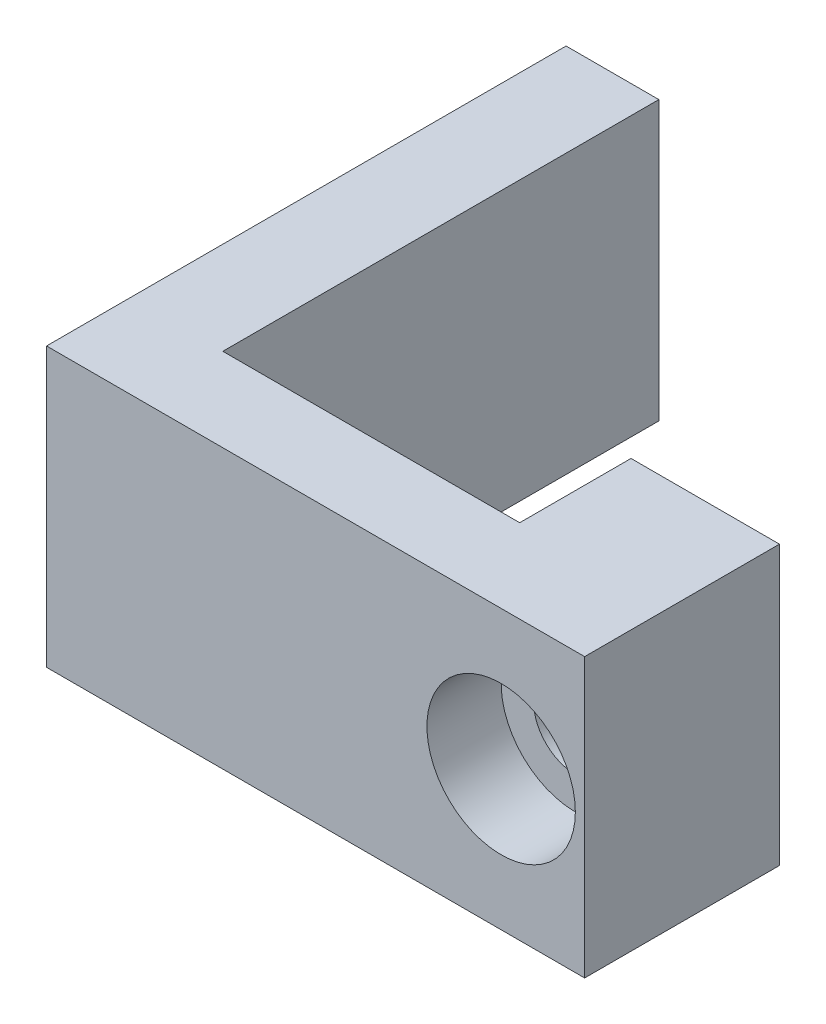
ISO-10303-21;
HEADER;
FILE_DESCRIPTION(('STEP AP214'),'2;1');
FILE_NAME('part.step','',(''),(''),'','','');
FILE_SCHEMA(('AUTOMOTIVE_DESIGN { 1 0 10303 214 1 1 1 1 }'));
ENDSEC;
DATA;
#1=APPLICATION_CONTEXT('core data for automotive mechanical design processes');
#2=APPLICATION_PROTOCOL_DEFINITION('international standard','automotive_design',2000,#1);
#3=PRODUCT_CONTEXT('',#1,'mechanical');
#4=PRODUCT('Part','Part','',(#3));
#5=PRODUCT_RELATED_PRODUCT_CATEGORY('part','',(#4));
#6=PRODUCT_DEFINITION_FORMATION('','',#4);
#7=PRODUCT_DEFINITION_CONTEXT('part definition',#1,'design');
#8=PRODUCT_DEFINITION('design','',#6,#7);
#9=PRODUCT_DEFINITION_SHAPE('','',#8);
#10=(LENGTH_UNIT() NAMED_UNIT(*) SI_UNIT(.MILLI.,.METRE.));
#11=(NAMED_UNIT(*) PLANE_ANGLE_UNIT() SI_UNIT($,.RADIAN.));
#12=(NAMED_UNIT(*) SI_UNIT($,.STERADIAN.) SOLID_ANGLE_UNIT());
#13=UNCERTAINTY_MEASURE_WITH_UNIT(LENGTH_MEASURE(1.E-05),#10,'distance_accuracy_value','');
#14=(GEOMETRIC_REPRESENTATION_CONTEXT(3) GLOBAL_UNCERTAINTY_ASSIGNED_CONTEXT((#13)) GLOBAL_UNIT_ASSIGNED_CONTEXT((#10,
#11,#12)) REPRESENTATION_CONTEXT('',''));
#15=CARTESIAN_POINT('',(0.,0.,0.));
#16=DIRECTION('',(0.,0.,1.));
#17=DIRECTION('',(1.,0.,0.));
#18=AXIS2_PLACEMENT_3D('',#15,#16,#17);
#19=CARTESIAN_POINT('',(-62.,47.8112887414928,17.5));
#20=DIRECTION('',(-1.,0.,0.));
#21=DIRECTION('',(0.,0.,-1.));
#22=AXIS2_PLACEMENT_3D('',#19,#20,#21);
#23=PLANE('',#22);
#24=DIRECTION('',(0.,0.,1.));
#25=VECTOR('',#24,1.);
#26=CARTESIAN_POINT('',(-62.,7.5,17.5));
#27=LINE('',#26,#25);
#28=CARTESIAN_POINT('',(-62.,7.5,17.5));
#29=VERTEX_POINT('',#28);
#30=CARTESIAN_POINT('',(-62.,7.50000000000001,28.));
#31=VERTEX_POINT('',#30);
#32=EDGE_CURVE('E110',#29,#31,#27,.T.);
#33=ORIENTED_EDGE('',*,*,#32,.T.);
#34=DIRECTION('',(0.,-1.,0.));
#35=VECTOR('',#34,1.);
#36=CARTESIAN_POINT('',(-62.,47.8112887414928,28.));
#37=LINE('',#36,#35);
#38=CARTESIAN_POINT('',(-62.,-7.5,28.));
#39=VERTEX_POINT('',#38);
#40=EDGE_CURVE('E115',#31,#39,#37,.T.);
#41=ORIENTED_EDGE('',*,*,#40,.T.);
#42=DIRECTION('',(0.,0.,-1.));
#43=VECTOR('',#42,1.);
#44=CARTESIAN_POINT('',(-62.,-7.5,17.5));
#45=LINE('',#44,#43);
#46=CARTESIAN_POINT('',(-62.,-7.5,17.5));
#47=VERTEX_POINT('',#46);
#48=EDGE_CURVE('E133',#39,#47,#45,.T.);
#49=ORIENTED_EDGE('',*,*,#48,.T.);
#50=DIRECTION('',(0.,-1.,0.));
#51=VECTOR('',#50,1.);
#52=CARTESIAN_POINT('',(-62.,47.8112887414928,17.5));
#53=LINE('',#52,#51);
#54=EDGE_CURVE('E119',#29,#47,#53,.T.);
#55=ORIENTED_EDGE('',*,*,#54,.F.);
#56=EDGE_LOOP('',(#33,#41,#49,#55));
#57=FACE_BOUND('',#56,.T.);
#58=ADVANCED_FACE('F32',(#57),#23,.F.);
#59=CARTESIAN_POINT('',(-62.,47.8112887414928,28.));
#60=DIRECTION('',(0.,0.,-1.));
#61=DIRECTION('',(1.,0.,0.));
#62=AXIS2_PLACEMENT_3D('',#59,#60,#61);
#63=PLANE('',#62);
#64=CARTESIAN_POINT('',(-66.5,0.,28.));
#65=DIRECTION('',(0.,0.,1.));
#66=DIRECTION('',(1.,0.,0.));
#67=AXIS2_PLACEMENT_3D('',#64,#65,#66);
#68=CIRCLE('',#67,3.99999999999999);
#69=CARTESIAN_POINT('',(-62.5,0.,28.));
#70=VERTEX_POINT('',#69);
#71=EDGE_CURVE('E245',#70,#70,#68,.T.);
#72=ORIENTED_EDGE('',*,*,#71,.F.);
#73=EDGE_LOOP('',(#72));
#74=FACE_BOUND('',#73,.T.);
#75=DIRECTION('',(-1.,0.,0.));
#76=VECTOR('',#75,1.);
#77=CARTESIAN_POINT('',(-62.,7.5,28.));
#78=LINE('',#77,#76);
#79=CARTESIAN_POINT('',(-91.,7.50000000000001,28.));
#80=VERTEX_POINT('',#79);
#81=EDGE_CURVE('E107',#31,#80,#78,.T.);
#82=ORIENTED_EDGE('',*,*,#81,.T.);
#83=DIRECTION('',(0.,-1.,0.));
#84=VECTOR('',#83,1.);
#85=CARTESIAN_POINT('',(-91.,47.8112887414928,28.));
#86=LINE('',#85,#84);
#87=CARTESIAN_POINT('',(-91.,-7.50000000000001,28.));
#88=VERTEX_POINT('',#87);
#89=EDGE_CURVE('E118',#80,#88,#86,.T.);
#90=ORIENTED_EDGE('',*,*,#89,.T.);
#91=DIRECTION('',(1.,0.,0.));
#92=VECTOR('',#91,1.);
#93=CARTESIAN_POINT('',(-62.,-7.5,28.));
#94=LINE('',#93,#92);
#95=EDGE_CURVE('E128',#88,#39,#94,.T.);
#96=ORIENTED_EDGE('',*,*,#95,.T.);
#97=ORIENTED_EDGE('',*,*,#40,.F.);
#98=EDGE_LOOP('',(#82,#90,#96,#97));
#99=FACE_BOUND('',#98,.T.);
#100=ADVANCED_FACE('F172',(#74,#99),#63,.F.);
#101=CARTESIAN_POINT('',(-91.,47.8112887414928,28.));
#102=DIRECTION('',(1.,0.,0.));
#103=DIRECTION('',(0.,0.,1.));
#104=AXIS2_PLACEMENT_3D('',#101,#102,#103);
#105=PLANE('',#104);
#106=DIRECTION('',(0.,0.,-1.));
#107=VECTOR('',#106,1.);
#108=CARTESIAN_POINT('',(-91.,7.5,28.));
#109=LINE('',#108,#107);
#110=CARTESIAN_POINT('',(-91.,7.50000000000001,0.));
#111=VERTEX_POINT('',#110);
#112=EDGE_CURVE('E101',#80,#111,#109,.T.);
#113=ORIENTED_EDGE('',*,*,#112,.T.);
#114=DIRECTION('',(0.,-1.,0.));
#115=VECTOR('',#114,1.);
#116=CARTESIAN_POINT('',(-91.,47.8112887414928,0.));
#117=LINE('',#116,#115);
#118=CARTESIAN_POINT('',(-91.,-7.5,0.));
#119=VERTEX_POINT('',#118);
#120=EDGE_CURVE('E122',#111,#119,#117,.T.);
#121=ORIENTED_EDGE('',*,*,#120,.T.);
#122=DIRECTION('',(0.,0.,1.));
#123=VECTOR('',#122,1.);
#124=CARTESIAN_POINT('',(-91.,-7.5,28.));
#125=LINE('',#124,#123);
#126=EDGE_CURVE('E164',#119,#88,#125,.T.);
#127=ORIENTED_EDGE('',*,*,#126,.T.);
#128=ORIENTED_EDGE('',*,*,#89,.F.);
#129=EDGE_LOOP('',(#113,#121,#127,#128));
#130=FACE_BOUND('',#129,.T.);
#131=ADVANCED_FACE('F165',(#130),#105,.F.);
#132=CARTESIAN_POINT('',(-91.,47.8112887414928,0.));
#133=DIRECTION('',(0.,0.,1.));
#134=DIRECTION('',(-1.,0.,0.));
#135=AXIS2_PLACEMENT_3D('',#132,#133,#134);
#136=PLANE('',#135);
#137=DIRECTION('',(1.,0.,0.));
#138=VECTOR('',#137,1.);
#139=CARTESIAN_POINT('',(-91.,7.5,0.));
#140=LINE('',#139,#138);
#141=CARTESIAN_POINT('',(-86.,7.50000000000001,0.));
#142=VERTEX_POINT('',#141);
#143=EDGE_CURVE('E99',#111,#142,#140,.T.);
#144=ORIENTED_EDGE('',*,*,#143,.T.);
#145=DIRECTION('',(0.,-1.,0.));
#146=VECTOR('',#145,1.);
#147=CARTESIAN_POINT('',(-86.,47.8112887414928,0.));
#148=LINE('',#147,#146);
#149=CARTESIAN_POINT('',(-86.,-7.5,0.));
#150=VERTEX_POINT('',#149);
#151=EDGE_CURVE('E94',#142,#150,#148,.T.);
#152=ORIENTED_EDGE('',*,*,#151,.T.);
#153=DIRECTION('',(-1.,0.,0.));
#154=VECTOR('',#153,1.);
#155=CARTESIAN_POINT('',(-91.,-7.5,0.));
#156=LINE('',#155,#154);
#157=EDGE_CURVE('E168',#150,#119,#156,.T.);
#158=ORIENTED_EDGE('',*,*,#157,.T.);
#159=ORIENTED_EDGE('',*,*,#120,.F.);
#160=EDGE_LOOP('',(#144,#152,#158,#159));
#161=FACE_BOUND('',#160,.T.);
#162=ADVANCED_FACE('F175',(#161),#136,.F.);
#163=CARTESIAN_POINT('',(-86.,47.8112887414928,23.5));
#164=DIRECTION('',(-1.,0.,0.));
#165=DIRECTION('',(0.,0.,-1.));
#166=AXIS2_PLACEMENT_3D('',#163,#164,#165);
#167=PLANE('',#166);
#168=DIRECTION('',(0.,0.,1.));
#169=VECTOR('',#168,1.);
#170=CARTESIAN_POINT('',(-86.,7.5,23.5));
#171=LINE('',#170,#169);
#172=CARTESIAN_POINT('',(-86.,7.50000000000001,23.5));
#173=VERTEX_POINT('',#172);
#174=EDGE_CURVE('E76',#142,#173,#171,.T.);
#175=ORIENTED_EDGE('',*,*,#174,.T.);
#176=DIRECTION('',(0.,-1.,0.));
#177=VECTOR('',#176,1.);
#178=CARTESIAN_POINT('',(-86.,47.8112887414928,23.5));
#179=LINE('',#178,#177);
#180=CARTESIAN_POINT('',(-86.,-7.5,23.5));
#181=VERTEX_POINT('',#180);
#182=EDGE_CURVE('E85',#173,#181,#179,.T.);
#183=ORIENTED_EDGE('',*,*,#182,.T.);
#184=DIRECTION('',(0.,0.,-1.));
#185=VECTOR('',#184,1.);
#186=CARTESIAN_POINT('',(-86.,-7.5,23.5));
#187=LINE('',#186,#185);
#188=EDGE_CURVE('E176',#181,#150,#187,.T.);
#189=ORIENTED_EDGE('',*,*,#188,.T.);
#190=ORIENTED_EDGE('',*,*,#151,.F.);
#191=EDGE_LOOP('',(#175,#183,#189,#190));
#192=FACE_BOUND('',#191,.T.);
#193=ADVANCED_FACE('F96',(#192),#167,.F.);
#194=CARTESIAN_POINT('',(-86.,47.8112887414928,23.5));
#195=DIRECTION('',(0.,0.,1.));
#196=DIRECTION('',(-1.,0.,0.));
#197=AXIS2_PLACEMENT_3D('',#194,#195,#196);
#198=PLANE('',#197);
#199=CARTESIAN_POINT('',(-78.,0.,23.5));
#200=DIRECTION('',(0.,0.,-1.));
#201=DIRECTION('',(-1.,0.,0.));
#202=AXIS2_PLACEMENT_3D('',#199,#200,#201);
#203=CIRCLE('',#202,2.);
#204=CARTESIAN_POINT('',(-80.,0.,23.5));
#205=VERTEX_POINT('',#204);
#206=EDGE_CURVE('E11',#205,#205,#203,.F.);
#207=ORIENTED_EDGE('',*,*,#206,.T.);
#208=EDGE_LOOP('',(#207));
#209=FACE_BOUND('',#208,.T.);
#210=DIRECTION('',(1.,0.,0.));
#211=VECTOR('',#210,1.);
#212=CARTESIAN_POINT('',(-86.,7.5,23.5));
#213=LINE('',#212,#211);
#214=CARTESIAN_POINT('',(-70.,7.50000000000001,23.5));
#215=VERTEX_POINT('',#214);
#216=EDGE_CURVE('E73',#173,#215,#213,.T.);
#217=ORIENTED_EDGE('',*,*,#216,.T.);
#218=DIRECTION('',(0.,-1.,0.));
#219=VECTOR('',#218,1.);
#220=CARTESIAN_POINT('',(-70.,47.8112887414928,23.5));
#221=LINE('',#220,#219);
#222=CARTESIAN_POINT('',(-70.,-7.5,23.5));
#223=VERTEX_POINT('',#222);
#224=EDGE_CURVE('E93',#215,#223,#221,.T.);
#225=ORIENTED_EDGE('',*,*,#224,.T.);
#226=DIRECTION('',(-1.,0.,0.));
#227=VECTOR('',#226,1.);
#228=CARTESIAN_POINT('',(-86.,-7.5,23.5));
#229=LINE('',#228,#227);
#230=EDGE_CURVE('E89',#223,#181,#229,.T.);
#231=ORIENTED_EDGE('',*,*,#230,.T.);
#232=ORIENTED_EDGE('',*,*,#182,.F.);
#233=EDGE_LOOP('',(#217,#225,#231,#232));
#234=FACE_BOUND('',#233,.T.);
#235=ADVANCED_FACE('F86',(#209,#234),#198,.F.);
#236=CARTESIAN_POINT('',(-70.,47.8112887414928,17.5));
#237=DIRECTION('',(1.,0.,0.));
#238=DIRECTION('',(0.,0.,1.));
#239=AXIS2_PLACEMENT_3D('',#236,#237,#238);
#240=PLANE('',#239);
#241=DIRECTION('',(0.,0.,-1.));
#242=VECTOR('',#241,1.);
#243=CARTESIAN_POINT('',(-70.,7.5,17.5));
#244=LINE('',#243,#242);
#245=CARTESIAN_POINT('',(-70.,7.50000000000001,17.5));
#246=VERTEX_POINT('',#245);
#247=EDGE_CURVE('E40',#215,#246,#244,.T.);
#248=ORIENTED_EDGE('',*,*,#247,.T.);
#249=DIRECTION('',(0.,-1.,0.));
#250=VECTOR('',#249,1.);
#251=CARTESIAN_POINT('',(-70.,47.8112887414928,17.5));
#252=LINE('',#251,#250);
#253=CARTESIAN_POINT('',(-70.,-7.5,17.5));
#254=VERTEX_POINT('',#253);
#255=EDGE_CURVE('E114',#246,#254,#252,.T.);
#256=ORIENTED_EDGE('',*,*,#255,.T.);
#257=DIRECTION('',(0.,0.,1.));
#258=VECTOR('',#257,1.);
#259=CARTESIAN_POINT('',(-70.,-7.5,17.5));
#260=LINE('',#259,#258);
#261=EDGE_CURVE('E149',#254,#223,#260,.T.);
#262=ORIENTED_EDGE('',*,*,#261,.T.);
#263=ORIENTED_EDGE('',*,*,#224,.F.);
#264=EDGE_LOOP('',(#248,#256,#262,#263));
#265=FACE_BOUND('',#264,.T.);
#266=ADVANCED_FACE('F144',(#265),#240,.F.);
#267=CARTESIAN_POINT('',(-62.,47.8112887414928,17.5));
#268=DIRECTION('',(0.,0.,1.));
#269=DIRECTION('',(-1.,0.,0.));
#270=AXIS2_PLACEMENT_3D('',#267,#268,#269);
#271=PLANE('',#270);
#272=CARTESIAN_POINT('',(-66.5,0.,17.5));
#273=DIRECTION('',(0.,0.,1.));
#274=DIRECTION('',(1.,0.,0.));
#275=AXIS2_PLACEMENT_3D('',#272,#273,#274);
#276=CIRCLE('',#275,2.25);
#277=CARTESIAN_POINT('',(-64.25,0.,17.5));
#278=VERTEX_POINT('',#277);
#279=EDGE_CURVE('E252',#278,#278,#276,.T.);
#280=ORIENTED_EDGE('',*,*,#279,.T.);
#281=EDGE_LOOP('',(#280));
#282=FACE_BOUND('',#281,.T.);
#283=DIRECTION('',(1.,0.,0.));
#284=VECTOR('',#283,1.);
#285=CARTESIAN_POINT('',(-62.,7.5,17.5));
#286=LINE('',#285,#284);
#287=EDGE_CURVE('E47',#246,#29,#286,.T.);
#288=ORIENTED_EDGE('',*,*,#287,.T.);
#289=ORIENTED_EDGE('',*,*,#54,.T.);
#290=DIRECTION('',(-1.,0.,0.));
#291=VECTOR('',#290,1.);
#292=CARTESIAN_POINT('',(-62.,-7.5,17.5));
#293=LINE('',#292,#291);
#294=EDGE_CURVE('E140',#47,#254,#293,.T.);
#295=ORIENTED_EDGE('',*,*,#294,.T.);
#296=ORIENTED_EDGE('',*,*,#255,.F.);
#297=EDGE_LOOP('',(#288,#289,#295,#296));
#298=FACE_BOUND('',#297,.T.);
#299=ADVANCED_FACE('F182',(#282,#298),#271,.F.);
#300=CARTESIAN_POINT('',(0.,7.5,0.));
#301=DIRECTION('',(0.,1.,0.));
#302=DIRECTION('',(0.,0.,-1.));
#303=AXIS2_PLACEMENT_3D('',#300,#301,#302);
#304=PLANE('',#303);
#305=ORIENTED_EDGE('',*,*,#287,.F.);
#306=ORIENTED_EDGE('',*,*,#247,.F.);
#307=ORIENTED_EDGE('',*,*,#216,.F.);
#308=ORIENTED_EDGE('',*,*,#174,.F.);
#309=ORIENTED_EDGE('',*,*,#143,.F.);
#310=ORIENTED_EDGE('',*,*,#112,.F.);
#311=ORIENTED_EDGE('',*,*,#81,.F.);
#312=ORIENTED_EDGE('',*,*,#32,.F.);
#313=EDGE_LOOP('',(#305,#306,#307,#308,#309,#310,#311,#312));
#314=FACE_BOUND('',#313,.T.);
#315=ADVANCED_FACE('F34',(#314),#304,.T.);
#316=CARTESIAN_POINT('',(0.,-7.5,0.));
#317=DIRECTION('',(0.,1.,0.));
#318=DIRECTION('',(0.,0.,-1.));
#319=AXIS2_PLACEMENT_3D('',#316,#317,#318);
#320=PLANE('',#319);
#321=ORIENTED_EDGE('',*,*,#48,.F.);
#322=ORIENTED_EDGE('',*,*,#95,.F.);
#323=ORIENTED_EDGE('',*,*,#126,.F.);
#324=ORIENTED_EDGE('',*,*,#157,.F.);
#325=ORIENTED_EDGE('',*,*,#188,.F.);
#326=ORIENTED_EDGE('',*,*,#230,.F.);
#327=ORIENTED_EDGE('',*,*,#261,.F.);
#328=ORIENTED_EDGE('',*,*,#294,.F.);
#329=EDGE_LOOP('',(#321,#322,#323,#324,#325,#326,#327,#328));
#330=FACE_BOUND('',#329,.T.);
#331=ADVANCED_FACE('F171',(#330),#320,.F.);
#332=CARTESIAN_POINT('',(-78.,0.,20.5));
#333=DIRECTION('',(0.,0.,1.));
#334=DIRECTION('',(-1.,0.,0.));
#335=AXIS2_PLACEMENT_3D('',#332,#333,#334);
#336=CYLINDRICAL_SURFACE('',#335,2.);
#337=CARTESIAN_POINT('',(-78.,0.,20.5));
#338=DIRECTION('',(0.,0.,1.));
#339=DIRECTION('',(1.,0.,0.));
#340=AXIS2_PLACEMENT_3D('',#337,#338,#339);
#341=CIRCLE('',#340,2.);
#342=CARTESIAN_POINT('',(-76.,0.,20.5));
#343=VERTEX_POINT('',#342);
#344=EDGE_CURVE('E169',#343,#343,#341,.T.);
#345=ORIENTED_EDGE('',*,*,#344,.T.);
#346=EDGE_LOOP('',(#345));
#347=FACE_BOUND('',#346,.T.);
#348=ORIENTED_EDGE('',*,*,#206,.F.);
#349=EDGE_LOOP('',(#348));
#350=FACE_BOUND('',#349,.T.);
#351=ADVANCED_FACE('F213',(#347,#350),#336,.T.);
#352=CARTESIAN_POINT('',(-78.,0.,20.5));
#353=DIRECTION('',(0.,0.,-1.));
#354=DIRECTION('',(1.,0.,0.));
#355=AXIS2_PLACEMENT_3D('',#352,#353,#354);
#356=PLANE('',#355);
#357=ORIENTED_EDGE('',*,*,#344,.F.);
#358=EDGE_LOOP('',(#357));
#359=FACE_BOUND('',#358,.T.);
#360=ADVANCED_FACE('F215',(#359),#356,.T.);
#361=CARTESIAN_POINT('',(-66.5,0.,28.));
#362=DIRECTION('',(0.,0.,1.));
#363=DIRECTION('',(1.,0.,0.));
#364=AXIS2_PLACEMENT_3D('',#361,#362,#363);
#365=CYLINDRICAL_SURFACE('',#364,2.25);
#366=ORIENTED_EDGE('',*,*,#279,.F.);
#367=EDGE_LOOP('',(#366));
#368=FACE_BOUND('',#367,.T.);
#369=CARTESIAN_POINT('',(-66.5,0.,24.));
#370=DIRECTION('',(0.,0.,1.));
#371=DIRECTION('',(1.,0.,0.));
#372=AXIS2_PLACEMENT_3D('',#369,#370,#371);
#373=CIRCLE('',#372,2.24999999999999);
#374=CARTESIAN_POINT('',(-64.25,0.,24.));
#375=VERTEX_POINT('',#374);
#376=EDGE_CURVE('E247',#375,#375,#373,.T.);
#377=ORIENTED_EDGE('',*,*,#376,.T.);
#378=EDGE_LOOP('',(#377));
#379=FACE_BOUND('',#378,.T.);
#380=ADVANCED_FACE('F222',(#368,#379),#365,.F.);
#381=CARTESIAN_POINT('',(-64.25,0.,24.));
#382=DIRECTION('',(0.,0.,-1.));
#383=DIRECTION('',(-1.,0.,0.));
#384=AXIS2_PLACEMENT_3D('',#381,#382,#383);
#385=PLANE('',#384);
#386=ORIENTED_EDGE('',*,*,#376,.F.);
#387=EDGE_LOOP('',(#386));
#388=FACE_BOUND('',#387,.T.);
#389=CARTESIAN_POINT('',(-66.5,0.,24.));
#390=DIRECTION('',(0.,0.,1.));
#391=DIRECTION('',(1.,0.,0.));
#392=AXIS2_PLACEMENT_3D('',#389,#390,#391);
#393=CIRCLE('',#392,4.);
#394=CARTESIAN_POINT('',(-62.5,0.,24.));
#395=VERTEX_POINT('',#394);
#396=EDGE_CURVE('E242',#395,#395,#393,.T.);
#397=ORIENTED_EDGE('',*,*,#396,.T.);
#398=EDGE_LOOP('',(#397));
#399=FACE_BOUND('',#398,.T.);
#400=ADVANCED_FACE('F229',(#388,#399),#385,.F.);
#401=CARTESIAN_POINT('',(-66.5,0.,28.));
#402=DIRECTION('',(0.,0.,1.));
#403=DIRECTION('',(1.,0.,0.));
#404=AXIS2_PLACEMENT_3D('',#401,#402,#403);
#405=CYLINDRICAL_SURFACE('',#404,4.);
#406=ORIENTED_EDGE('',*,*,#396,.F.);
#407=EDGE_LOOP('',(#406));
#408=FACE_BOUND('',#407,.T.);
#409=ORIENTED_EDGE('',*,*,#71,.T.);
#410=EDGE_LOOP('',(#409));
#411=FACE_BOUND('',#410,.T.);
#412=ADVANCED_FACE('F233',(#408,#411),#405,.F.);
#413=CLOSED_SHELL('',(#58,#100,#131,#162,#193,#235,#266,#299,#315,#331,#351,#360,#380,#400,#412));
#414=MANIFOLD_SOLID_BREP('B2',#413);
#415=ADVANCED_BREP_SHAPE_REPRESENTATION('',(#18,#414),#14);
#416=SHAPE_DEFINITION_REPRESENTATION(#9,#415);
ENDSEC;
END-ISO-10303-21;
